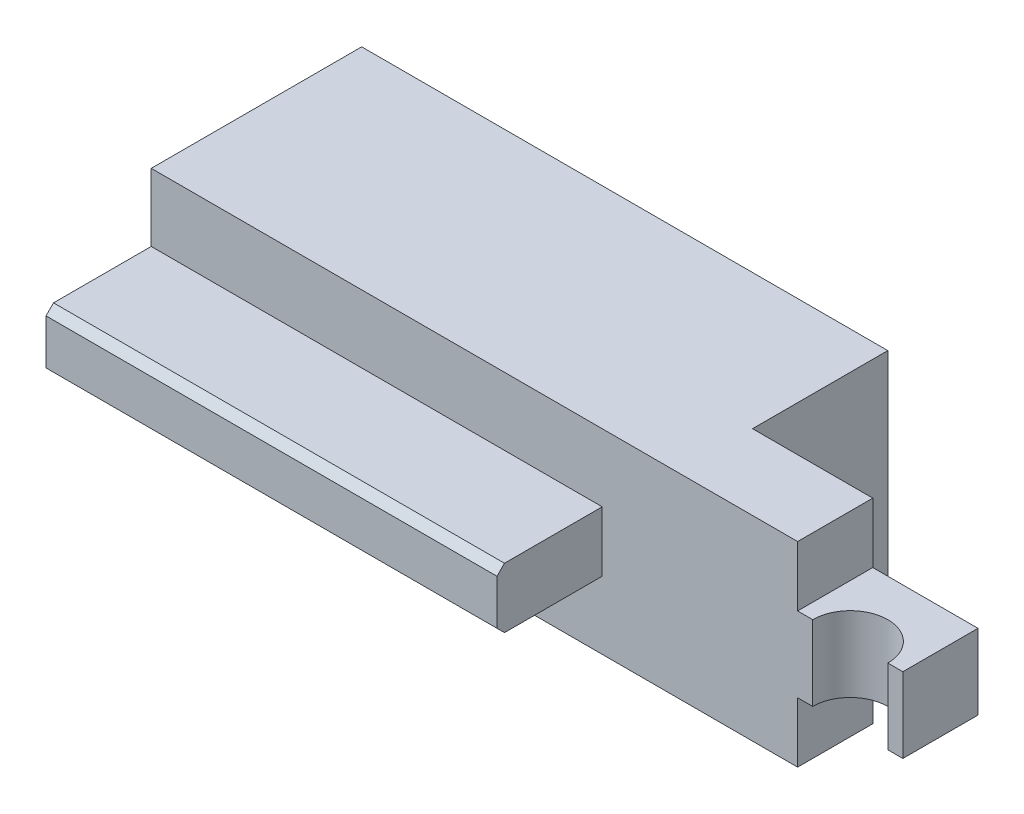
ISO-10303-21;
HEADER;
FILE_DESCRIPTION(('STEP AP214'),'2;1');
FILE_NAME('part.step','',(''),(''),'','','');
FILE_SCHEMA(('AUTOMOTIVE_DESIGN { 1 0 10303 214 1 1 1 1 }'));
ENDSEC;
DATA;
#1=APPLICATION_CONTEXT('core data for automotive mechanical design processes');
#2=APPLICATION_PROTOCOL_DEFINITION('international standard','automotive_design',2000,#1);
#3=PRODUCT_CONTEXT('',#1,'mechanical');
#4=PRODUCT('Part','Part','',(#3));
#5=PRODUCT_RELATED_PRODUCT_CATEGORY('part','',(#4));
#6=PRODUCT_DEFINITION_FORMATION('','',#4);
#7=PRODUCT_DEFINITION_CONTEXT('part definition',#1,'design');
#8=PRODUCT_DEFINITION('design','',#6,#7);
#9=PRODUCT_DEFINITION_SHAPE('','',#8);
#10=(LENGTH_UNIT() NAMED_UNIT(*) SI_UNIT(.MILLI.,.METRE.));
#11=(NAMED_UNIT(*) PLANE_ANGLE_UNIT() SI_UNIT($,.RADIAN.));
#12=(NAMED_UNIT(*) SI_UNIT($,.STERADIAN.) SOLID_ANGLE_UNIT());
#13=UNCERTAINTY_MEASURE_WITH_UNIT(LENGTH_MEASURE(1.E-05),#10,'distance_accuracy_value','');
#14=(GEOMETRIC_REPRESENTATION_CONTEXT(3) GLOBAL_UNCERTAINTY_ASSIGNED_CONTEXT((#13)) GLOBAL_UNIT_ASSIGNED_CONTEXT((#10,
#11,#12)) REPRESENTATION_CONTEXT('',''));
#15=CARTESIAN_POINT('',(0.,0.,0.));
#16=DIRECTION('',(0.,0.,1.));
#17=DIRECTION('',(1.,0.,0.));
#18=AXIS2_PLACEMENT_3D('',#15,#16,#17);
#19=CARTESIAN_POINT('',(43.,11.,25.));
#20=DIRECTION('',(-1.,0.,0.));
#21=DIRECTION('',(0.,0.,1.));
#22=AXIS2_PLACEMENT_3D('',#19,#20,#21);
#23=PLANE('',#22);
#24=DIRECTION('',(0.,0.,1.));
#25=VECTOR('',#24,1.);
#26=CARTESIAN_POINT('',(43.,2.00000000000001,25.));
#27=LINE('',#26,#25);
#28=CARTESIAN_POINT('',(43.,2.,-16.));
#29=VERTEX_POINT('',#28);
#30=CARTESIAN_POINT('',(43.,2.,-11.));
#31=VERTEX_POINT('',#30);
#32=EDGE_CURVE('E355',#29,#31,#27,.T.);
#33=ORIENTED_EDGE('',*,*,#32,.F.);
#34=DIRECTION('',(0.,-1.,0.));
#35=VECTOR('',#34,1.);
#36=CARTESIAN_POINT('',(43.,15.,-16.));
#37=LINE('',#36,#35);
#38=CARTESIAN_POINT('',(43.,6.,-16.));
#39=VERTEX_POINT('',#38);
#40=EDGE_CURVE('E437',#39,#29,#37,.T.);
#41=ORIENTED_EDGE('',*,*,#40,.F.);
#42=DIRECTION('',(0.,0.,-1.));
#43=VECTOR('',#42,1.);
#44=CARTESIAN_POINT('',(43.,6.,25.));
#45=LINE('',#44,#43);
#46=CARTESIAN_POINT('',(43.,6.,-11.));
#47=VERTEX_POINT('',#46);
#48=EDGE_CURVE('E312',#47,#39,#45,.T.);
#49=ORIENTED_EDGE('',*,*,#48,.F.);
#50=DIRECTION('',(0.,-1.,0.));
#51=VECTOR('',#50,1.);
#52=CARTESIAN_POINT('',(43.,11.,-11.));
#53=LINE('',#52,#51);
#54=EDGE_CURVE('E338',#47,#31,#53,.T.);
#55=ORIENTED_EDGE('',*,*,#54,.T.);
#56=EDGE_LOOP('',(#33,#41,#49,#55));
#57=FACE_BOUND('',#56,.T.);
#58=ADVANCED_FACE('F44',(#57),#23,.F.);
#59=CARTESIAN_POINT('',(0.,0.,0.));
#60=DIRECTION('',(1.,0.,0.));
#61=DIRECTION('',(0.,0.,-1.));
#62=AXIS2_PLACEMENT_3D('',#59,#60,#61);
#63=PLANE('',#62);
#64=DIRECTION('',(0.,-1.,0.));
#65=VECTOR('',#64,1.);
#66=CARTESIAN_POINT('',(0.,12.,-22.));
#67=LINE('',#66,#65);
#68=CARTESIAN_POINT('',(0.,12.,-22.));
#69=VERTEX_POINT('',#68);
#70=CARTESIAN_POINT('',(0.,5.,-22.));
#71=VERTEX_POINT('',#70);
#72=EDGE_CURVE('E266',#69,#71,#67,.T.);
#73=ORIENTED_EDGE('',*,*,#72,.F.);
#74=DIRECTION('',(0.,0.,-1.));
#75=VECTOR('',#74,1.);
#76=CARTESIAN_POINT('',(0.,12.,-22.));
#77=LINE('',#76,#75);
#78=CARTESIAN_POINT('',(0.,12.,-14.));
#79=VERTEX_POINT('',#78);
#80=EDGE_CURVE('E250',#79,#69,#77,.T.);
#81=ORIENTED_EDGE('',*,*,#80,.F.);
#82=DIRECTION('',(0.,1.,0.));
#83=VECTOR('',#82,1.);
#84=CARTESIAN_POINT('',(0.,12.,-14.));
#85=LINE('',#84,#83);
#86=CARTESIAN_POINT('',(0.,5.,-14.));
#87=VERTEX_POINT('',#86);
#88=EDGE_CURVE('E255',#87,#79,#85,.T.);
#89=ORIENTED_EDGE('',*,*,#88,.F.);
#90=DIRECTION('',(0.,0.,1.));
#91=VECTOR('',#90,1.);
#92=CARTESIAN_POINT('',(0.,5.,-14.));
#93=LINE('',#92,#91);
#94=EDGE_CURVE('E269',#71,#87,#93,.T.);
#95=ORIENTED_EDGE('',*,*,#94,.F.);
#96=EDGE_LOOP('',(#73,#81,#89,#95));
#97=FACE_BOUND('',#96,.T.);
#98=DIRECTION('',(0.,-0.707106781186547,0.707106781186548));
#99=VECTOR('',#98,1.);
#100=CARTESIAN_POINT('',(0.,11.,-5.));
#101=LINE('',#100,#99);
#102=CARTESIAN_POINT('',(0.,10.5,-4.5));
#103=VERTEX_POINT('',#102);
#104=CARTESIAN_POINT('',(0.,10.,-4.));
#105=VERTEX_POINT('',#104);
#106=EDGE_CURVE('E243',#103,#105,#101,.T.);
#107=ORIENTED_EDGE('',*,*,#106,.F.);
#108=DIRECTION('',(0.,0.,1.));
#109=VECTOR('',#108,1.);
#110=CARTESIAN_POINT('',(0.,10.5,-11.));
#111=LINE('',#110,#109);
#112=CARTESIAN_POINT('',(0.,10.5,-11.));
#113=VERTEX_POINT('',#112);
#114=EDGE_CURVE('E227',#113,#103,#111,.T.);
#115=ORIENTED_EDGE('',*,*,#114,.F.);
#116=DIRECTION('',(0.,1.,0.));
#117=VECTOR('',#116,1.);
#118=CARTESIAN_POINT('',(0.,11.,-11.));
#119=LINE('',#118,#117);
#120=CARTESIAN_POINT('',(0.,15.,-11.));
#121=VERTEX_POINT('',#120);
#122=EDGE_CURVE('E331',#113,#121,#119,.T.);
#123=ORIENTED_EDGE('',*,*,#122,.T.);
#124=DIRECTION('',(0.,0.,1.));
#125=VECTOR('',#124,1.);
#126=CARTESIAN_POINT('',(0.,15.,0.));
#127=LINE('',#126,#125);
#128=CARTESIAN_POINT('',(0.,15.,-25.));
#129=VERTEX_POINT('',#128);
#130=EDGE_CURVE('E286',#129,#121,#127,.T.);
#131=ORIENTED_EDGE('',*,*,#130,.F.);
#132=DIRECTION('',(0.,1.,0.));
#133=VECTOR('',#132,1.);
#134=CARTESIAN_POINT('',(0.,0.,-25.));
#135=LINE('',#134,#133);
#136=CARTESIAN_POINT('',(0.,2.,-25.));
#137=VERTEX_POINT('',#136);
#138=EDGE_CURVE('E330',#137,#129,#135,.T.);
#139=ORIENTED_EDGE('',*,*,#138,.F.);
#140=DIRECTION('',(0.,0.,1.));
#141=VECTOR('',#140,1.);
#142=CARTESIAN_POINT('',(0.,2.00000000000001,0.));
#143=LINE('',#142,#141);
#144=CARTESIAN_POINT('',(0.,2.,-11.));
#145=VERTEX_POINT('',#144);
#146=EDGE_CURVE('E285',#137,#145,#143,.T.);
#147=ORIENTED_EDGE('',*,*,#146,.T.);
#148=DIRECTION('',(0.,-1.,0.));
#149=VECTOR('',#148,1.);
#150=CARTESIAN_POINT('',(0.,6.,-11.));
#151=LINE('',#150,#149);
#152=CARTESIAN_POINT('',(0.,6.5,-11.));
#153=VERTEX_POINT('',#152);
#154=EDGE_CURVE('E327',#153,#145,#151,.T.);
#155=ORIENTED_EDGE('',*,*,#154,.F.);
#156=DIRECTION('',(0.,0.,-1.));
#157=VECTOR('',#156,1.);
#158=CARTESIAN_POINT('',(0.,6.5,-11.));
#159=LINE('',#158,#157);
#160=CARTESIAN_POINT('',(0.,6.5,-4.5));
#161=VERTEX_POINT('',#160);
#162=EDGE_CURVE('E234',#161,#153,#159,.T.);
#163=ORIENTED_EDGE('',*,*,#162,.F.);
#164=DIRECTION('',(0.,0.707106781186548,0.707106781186548));
#165=VECTOR('',#164,1.);
#166=CARTESIAN_POINT('',(0.,6.,-5.));
#167=LINE('',#166,#165);
#168=CARTESIAN_POINT('',(0.,7.,-4.));
#169=VERTEX_POINT('',#168);
#170=EDGE_CURVE('E242',#161,#169,#167,.T.);
#171=ORIENTED_EDGE('',*,*,#170,.T.);
#172=DIRECTION('',(0.,-1.,0.));
#173=VECTOR('',#172,1.);
#174=CARTESIAN_POINT('',(0.,11.,-4.));
#175=LINE('',#174,#173);
#176=EDGE_CURVE('E276',#105,#169,#175,.T.);
#177=ORIENTED_EDGE('',*,*,#176,.F.);
#178=EDGE_LOOP('',(#107,#115,#123,#131,#139,#147,#155,#163,#171,#177));
#179=FACE_BOUND('',#178,.T.);
#180=ADVANCED_FACE('F390',(#97,#179),#63,.F.);
#181=CARTESIAN_POINT('',(30.,-39.,-11.));
#182=DIRECTION('',(-1.,0.,0.));
#183=DIRECTION('',(0.,0.,1.));
#184=AXIS2_PLACEMENT_3D('',#181,#182,#183);
#185=PLANE('',#184);
#186=DIRECTION('',(0.,1.,0.));
#187=VECTOR('',#186,1.);
#188=CARTESIAN_POINT('',(30.,-39.,-11.));
#189=LINE('',#188,#187);
#190=CARTESIAN_POINT('',(30.,6.5,-11.));
#191=VERTEX_POINT('',#190);
#192=CARTESIAN_POINT('',(30.,10.5,-11.));
#193=VERTEX_POINT('',#192);
#194=EDGE_CURVE('E316',#191,#193,#189,.T.);
#195=ORIENTED_EDGE('',*,*,#194,.T.);
#196=DIRECTION('',(0.,0.,1.));
#197=VECTOR('',#196,1.);
#198=CARTESIAN_POINT('',(30.,10.5,-11.));
#199=LINE('',#198,#197);
#200=CARTESIAN_POINT('',(30.,10.5,-4.5));
#201=VERTEX_POINT('',#200);
#202=EDGE_CURVE('E233',#193,#201,#199,.T.);
#203=ORIENTED_EDGE('',*,*,#202,.T.);
#204=DIRECTION('',(0.,-0.707106781186547,0.707106781186548));
#205=VECTOR('',#204,1.);
#206=CARTESIAN_POINT('',(30.,-11.,17.));
#207=LINE('',#206,#205);
#208=CARTESIAN_POINT('',(30.,10.,-4.));
#209=VERTEX_POINT('',#208);
#210=EDGE_CURVE('E248',#201,#209,#207,.T.);
#211=ORIENTED_EDGE('',*,*,#210,.T.);
#212=DIRECTION('',(0.,-1.,0.));
#213=VECTOR('',#212,1.);
#214=CARTESIAN_POINT('',(30.,-39.,-4.));
#215=LINE('',#214,#213);
#216=CARTESIAN_POINT('',(30.,7.,-4.));
#217=VERTEX_POINT('',#216);
#218=EDGE_CURVE('E358',#209,#217,#215,.T.);
#219=ORIENTED_EDGE('',*,*,#218,.T.);
#220=DIRECTION('',(0.,0.707106781186548,0.707106781186548));
#221=VECTOR('',#220,1.);
#222=CARTESIAN_POINT('',(30.,-19.5,-30.5));
#223=LINE('',#222,#221);
#224=CARTESIAN_POINT('',(30.,6.5,-4.49999999999999));
#225=VERTEX_POINT('',#224);
#226=EDGE_CURVE('E245',#225,#217,#223,.T.);
#227=ORIENTED_EDGE('',*,*,#226,.F.);
#228=DIRECTION('',(0.,0.,-1.));
#229=VECTOR('',#228,1.);
#230=CARTESIAN_POINT('',(30.,6.50000000000001,-11.));
#231=LINE('',#230,#229);
#232=EDGE_CURVE('E68',#225,#191,#231,.T.);
#233=ORIENTED_EDGE('',*,*,#232,.T.);
#234=EDGE_LOOP('',(#195,#203,#211,#219,#227,#233));
#235=FACE_BOUND('',#234,.T.);
#236=ADVANCED_FACE('F397',(#235),#185,.F.);
#237=CARTESIAN_POINT('',(50.,11.,-4.));
#238=DIRECTION('',(0.,0.,-1.));
#239=DIRECTION('',(-1.,0.,0.));
#240=AXIS2_PLACEMENT_3D('',#237,#238,#239);
#241=PLANE('',#240);
#242=ORIENTED_EDGE('',*,*,#218,.F.);
#243=DIRECTION('',(-1.,0.,0.));
#244=VECTOR('',#243,1.);
#245=CARTESIAN_POINT('',(50.,10.,-4.));
#246=LINE('',#245,#244);
#247=EDGE_CURVE('E364',#209,#105,#246,.T.);
#248=ORIENTED_EDGE('',*,*,#247,.T.);
#249=ORIENTED_EDGE('',*,*,#176,.T.);
#250=DIRECTION('',(-1.,0.,0.));
#251=VECTOR('',#250,1.);
#252=CARTESIAN_POINT('',(50.,7.,-4.));
#253=LINE('',#252,#251);
#254=EDGE_CURVE('E361',#217,#169,#253,.T.);
#255=ORIENTED_EDGE('',*,*,#254,.F.);
#256=EDGE_LOOP('',(#242,#248,#249,#255));
#257=FACE_BOUND('',#256,.T.);
#258=ADVANCED_FACE('F467',(#257),#241,.F.);
#259=CARTESIAN_POINT('',(50.,0.,-25.));
#260=DIRECTION('',(0.,0.,1.));
#261=DIRECTION('',(1.,0.,0.));
#262=AXIS2_PLACEMENT_3D('',#259,#260,#261);
#263=PLANE('',#262);
#264=CARTESIAN_POINT('',(3.,8.5,-25.));
#265=DIRECTION('',(0.,0.,-1.));
#266=DIRECTION('',(-1.,0.,0.));
#267=AXIS2_PLACEMENT_3D('',#264,#265,#266);
#268=CIRCLE('',#267,1.55);
#269=CARTESIAN_POINT('',(1.45,8.5,-25.));
#270=VERTEX_POINT('',#269);
#271=EDGE_CURVE('E221',#270,#270,#268,.T.);
#272=ORIENTED_EDGE('',*,*,#271,.F.);
#273=EDGE_LOOP('',(#272));
#274=FACE_BOUND('',#273,.T.);
#275=CARTESIAN_POINT('',(11.,8.5,-25.));
#276=DIRECTION('',(0.,0.,-1.));
#277=DIRECTION('',(-1.,0.,0.));
#278=AXIS2_PLACEMENT_3D('',#275,#276,#277);
#279=CIRCLE('',#278,1.55);
#280=CARTESIAN_POINT('',(9.45,8.5,-25.));
#281=VERTEX_POINT('',#280);
#282=EDGE_CURVE('E216',#281,#281,#279,.T.);
#283=ORIENTED_EDGE('',*,*,#282,.F.);
#284=EDGE_LOOP('',(#283));
#285=FACE_BOUND('',#284,.T.);
#286=DIRECTION('',(-1.,0.,0.));
#287=VECTOR('',#286,1.);
#288=CARTESIAN_POINT('',(50.,15.,-25.));
#289=LINE('',#288,#287);
#290=CARTESIAN_POINT('',(35.,15.,-25.));
#291=VERTEX_POINT('',#290);
#292=EDGE_CURVE('E288',#291,#129,#289,.T.);
#293=ORIENTED_EDGE('',*,*,#292,.F.);
#294=DIRECTION('',(0.,1.,0.));
#295=VECTOR('',#294,1.);
#296=CARTESIAN_POINT('',(35.,15.,-25.));
#297=LINE('',#296,#295);
#298=CARTESIAN_POINT('',(35.,2.,-25.));
#299=VERTEX_POINT('',#298);
#300=EDGE_CURVE('E61',#299,#291,#297,.T.);
#301=ORIENTED_EDGE('',*,*,#300,.F.);
#302=DIRECTION('',(-1.,0.,0.));
#303=VECTOR('',#302,1.);
#304=CARTESIAN_POINT('',(50.,2.,-25.));
#305=LINE('',#304,#303);
#306=EDGE_CURVE('E297',#299,#137,#305,.T.);
#307=ORIENTED_EDGE('',*,*,#306,.T.);
#308=ORIENTED_EDGE('',*,*,#138,.T.);
#309=EDGE_LOOP('',(#293,#301,#307,#308));
#310=FACE_BOUND('',#309,.T.);
#311=ADVANCED_FACE('F46',(#274,#285,#310),#263,.F.);
#312=CARTESIAN_POINT('',(50.,11.,-11.));
#313=DIRECTION('',(0.,0.,1.));
#314=DIRECTION('',(1.,0.,0.));
#315=AXIS2_PLACEMENT_3D('',#312,#313,#314);
#316=PLANE('',#315);
#317=DIRECTION('',(-1.,0.,0.));
#318=VECTOR('',#317,1.);
#319=CARTESIAN_POINT('',(50.,10.5,-11.));
#320=LINE('',#319,#318);
#321=EDGE_CURVE('E229',#193,#113,#320,.T.);
#322=ORIENTED_EDGE('',*,*,#321,.F.);
#323=ORIENTED_EDGE('',*,*,#194,.F.);
#324=DIRECTION('',(-1.,0.,0.));
#325=VECTOR('',#324,1.);
#326=CARTESIAN_POINT('',(50.,6.5,-11.));
#327=LINE('',#326,#325);
#328=EDGE_CURVE('E230',#191,#153,#327,.T.);
#329=ORIENTED_EDGE('',*,*,#328,.T.);
#330=ORIENTED_EDGE('',*,*,#154,.T.);
#331=DIRECTION('',(-1.,0.,0.));
#332=VECTOR('',#331,1.);
#333=CARTESIAN_POINT('',(50.,2.,-11.));
#334=LINE('',#333,#332);
#335=EDGE_CURVE('E289',#31,#145,#334,.T.);
#336=ORIENTED_EDGE('',*,*,#335,.F.);
#337=ORIENTED_EDGE('',*,*,#54,.F.);
#338=DIRECTION('',(-1.,0.,0.));
#339=VECTOR('',#338,1.);
#340=CARTESIAN_POINT('',(50.,6.,-11.));
#341=LINE('',#340,#339);
#342=CARTESIAN_POINT('',(44.,6.,-11.));
#343=VERTEX_POINT('',#342);
#344=EDGE_CURVE('E341',#343,#47,#341,.T.);
#345=ORIENTED_EDGE('',*,*,#344,.F.);
#346=DIRECTION('',(0.,1.,0.));
#347=VECTOR('',#346,1.);
#348=CARTESIAN_POINT('',(44.,-39.,-11.));
#349=LINE('',#348,#347);
#350=CARTESIAN_POINT('',(44.,11.,-11.));
#351=VERTEX_POINT('',#350);
#352=EDGE_CURVE('E351',#351,#343,#349,.F.);
#353=ORIENTED_EDGE('',*,*,#352,.F.);
#354=DIRECTION('',(1.,0.,0.));
#355=VECTOR('',#354,1.);
#356=CARTESIAN_POINT('',(50.,11.,-11.));
#357=LINE('',#356,#355);
#358=CARTESIAN_POINT('',(43.,11.,-11.));
#359=VERTEX_POINT('',#358);
#360=EDGE_CURVE('E346',#359,#351,#357,.T.);
#361=ORIENTED_EDGE('',*,*,#360,.F.);
#362=DIRECTION('',(0.,-1.,0.));
#363=VECTOR('',#362,1.);
#364=CARTESIAN_POINT('',(43.,11.,-11.));
#365=LINE('',#364,#363);
#366=CARTESIAN_POINT('',(43.,15.,-11.));
#367=VERTEX_POINT('',#366);
#368=EDGE_CURVE('E349',#367,#359,#365,.T.);
#369=ORIENTED_EDGE('',*,*,#368,.F.);
#370=DIRECTION('',(-1.,0.,0.));
#371=VECTOR('',#370,1.);
#372=CARTESIAN_POINT('',(50.,15.,-11.));
#373=LINE('',#372,#371);
#374=EDGE_CURVE('E290',#367,#121,#373,.T.);
#375=ORIENTED_EDGE('',*,*,#374,.T.);
#376=ORIENTED_EDGE('',*,*,#122,.F.);
#377=EDGE_LOOP('',(#322,#323,#329,#330,#336,#337,#345,#353,#361,#369,#375,#376));
#378=FACE_BOUND('',#377,.T.);
#379=ADVANCED_FACE('F404',(#378),#316,.T.);
#380=DIRECTION('',(0.,0.,-1.));
#381=VECTOR('',#380,1.);
#382=CARTESIAN_POINT('',(43.,11.,25.));
#383=LINE('',#382,#381);
#384=CARTESIAN_POINT('',(43.,11.,-16.));
#385=VERTEX_POINT('',#384);
#386=EDGE_CURVE('E313',#359,#385,#383,.T.);
#387=ORIENTED_EDGE('',*,*,#386,.T.);
#388=CARTESIAN_POINT('',(43.,15.,-16.));
#389=VERTEX_POINT('',#388);
#390=EDGE_CURVE('E209',#389,#385,#37,.T.);
#391=ORIENTED_EDGE('',*,*,#390,.F.);
#392=DIRECTION('',(0.,0.,1.));
#393=VECTOR('',#392,1.);
#394=CARTESIAN_POINT('',(43.,15.,25.));
#395=LINE('',#394,#393);
#396=EDGE_CURVE('E214',#389,#367,#395,.T.);
#397=ORIENTED_EDGE('',*,*,#396,.T.);
#398=ORIENTED_EDGE('',*,*,#368,.T.);
#399=EDGE_LOOP('',(#387,#391,#397,#398));
#400=FACE_BOUND('',#399,.T.);
#401=ADVANCED_FACE('F393',(#400),#23,.F.);
#402=DIRECTION('',(0.,1.,0.));
#403=VECTOR('',#402,1.);
#404=CARTESIAN_POINT('',(50.,11.,-11.));
#405=LINE('',#404,#403);
#406=CARTESIAN_POINT('',(50.,6.,-11.));
#407=VERTEX_POINT('',#406);
#408=CARTESIAN_POINT('',(50.,11.,-11.));
#409=VERTEX_POINT('',#408);
#410=EDGE_CURVE('E328',#407,#409,#405,.T.);
#411=ORIENTED_EDGE('',*,*,#410,.T.);
#412=CARTESIAN_POINT('',(49.,11.,-11.));
#413=VERTEX_POINT('',#412);
#414=EDGE_CURVE('E345',#413,#409,#357,.T.);
#415=ORIENTED_EDGE('',*,*,#414,.F.);
#416=DIRECTION('',(0.,1.,0.));
#417=VECTOR('',#416,1.);
#418=CARTESIAN_POINT('',(49.,-39.,-11.));
#419=LINE('',#418,#417);
#420=CARTESIAN_POINT('',(49.,6.,-11.));
#421=VERTEX_POINT('',#420);
#422=EDGE_CURVE('E353',#421,#413,#419,.T.);
#423=ORIENTED_EDGE('',*,*,#422,.F.);
#424=EDGE_CURVE('E342',#407,#421,#341,.T.);
#425=ORIENTED_EDGE('',*,*,#424,.F.);
#426=EDGE_LOOP('',(#411,#415,#423,#425));
#427=FACE_BOUND('',#426,.T.);
#428=ADVANCED_FACE('F403',(#427),#316,.T.);
#429=CARTESIAN_POINT('',(50.,0.,0.));
#430=DIRECTION('',(1.,0.,0.));
#431=DIRECTION('',(0.,0.,-1.));
#432=AXIS2_PLACEMENT_3D('',#429,#430,#431);
#433=PLANE('',#432);
#434=DIRECTION('',(0.,0.,-1.));
#435=VECTOR('',#434,1.);
#436=CARTESIAN_POINT('',(50.,6.,25.));
#437=LINE('',#436,#435);
#438=CARTESIAN_POINT('',(50.,6.,-16.));
#439=VERTEX_POINT('',#438);
#440=EDGE_CURVE('E320',#407,#439,#437,.T.);
#441=ORIENTED_EDGE('',*,*,#440,.T.);
#442=DIRECTION('',(0.,1.,0.));
#443=VECTOR('',#442,1.);
#444=CARTESIAN_POINT('',(50.,-39.,-16.));
#445=LINE('',#444,#443);
#446=CARTESIAN_POINT('',(50.,11.,-16.));
#447=VERTEX_POINT('',#446);
#448=EDGE_CURVE('E307',#439,#447,#445,.T.);
#449=ORIENTED_EDGE('',*,*,#448,.T.);
#450=DIRECTION('',(0.,0.,-1.));
#451=VECTOR('',#450,1.);
#452=CARTESIAN_POINT('',(50.,11.,25.));
#453=LINE('',#452,#451);
#454=EDGE_CURVE('E317',#409,#447,#453,.T.);
#455=ORIENTED_EDGE('',*,*,#454,.F.);
#456=ORIENTED_EDGE('',*,*,#410,.F.);
#457=EDGE_LOOP('',(#441,#449,#455,#456));
#458=FACE_BOUND('',#457,.T.);
#459=ADVANCED_FACE('F410',(#458),#433,.T.);
#460=CARTESIAN_POINT('',(50.,6.,25.));
#461=DIRECTION('',(0.,1.,0.));
#462=DIRECTION('',(0.,0.,1.));
#463=AXIS2_PLACEMENT_3D('',#460,#461,#462);
#464=PLANE('',#463);
#465=ORIENTED_EDGE('',*,*,#424,.T.);
#466=CARTESIAN_POINT('',(46.5,6.,-11.));
#467=DIRECTION('',(0.,1.,0.));
#468=DIRECTION('',(0.,0.,1.));
#469=AXIS2_PLACEMENT_3D('',#466,#467,#468);
#470=CIRCLE('',#469,2.5);
#471=EDGE_CURVE('E301',#421,#343,#470,.T.);
#472=ORIENTED_EDGE('',*,*,#471,.T.);
#473=ORIENTED_EDGE('',*,*,#344,.T.);
#474=ORIENTED_EDGE('',*,*,#48,.T.);
#475=DIRECTION('',(-1.,0.,0.));
#476=VECTOR('',#475,1.);
#477=CARTESIAN_POINT('',(50.,6.,-16.));
#478=LINE('',#477,#476);
#479=EDGE_CURVE('E310',#439,#39,#478,.T.);
#480=ORIENTED_EDGE('',*,*,#479,.F.);
#481=ORIENTED_EDGE('',*,*,#440,.F.);
#482=EDGE_LOOP('',(#465,#472,#473,#474,#480,#481));
#483=FACE_BOUND('',#482,.T.);
#484=ADVANCED_FACE('F428',(#483),#464,.F.);
#485=CARTESIAN_POINT('',(50.,11.,25.));
#486=DIRECTION('',(0.,-1.,0.));
#487=DIRECTION('',(0.,0.,-1.));
#488=AXIS2_PLACEMENT_3D('',#485,#486,#487);
#489=PLANE('',#488);
#490=ORIENTED_EDGE('',*,*,#360,.T.);
#491=CARTESIAN_POINT('',(46.5,11.,-11.));
#492=DIRECTION('',(0.,1.,0.));
#493=DIRECTION('',(0.,0.,1.));
#494=AXIS2_PLACEMENT_3D('',#491,#492,#493);
#495=CIRCLE('',#494,2.5);
#496=EDGE_CURVE('E293',#413,#351,#495,.T.);
#497=ORIENTED_EDGE('',*,*,#496,.F.);
#498=ORIENTED_EDGE('',*,*,#414,.T.);
#499=ORIENTED_EDGE('',*,*,#454,.T.);
#500=DIRECTION('',(-1.,0.,0.));
#501=VECTOR('',#500,1.);
#502=CARTESIAN_POINT('',(50.,11.,-16.));
#503=LINE('',#502,#501);
#504=EDGE_CURVE('E304',#447,#385,#503,.T.);
#505=ORIENTED_EDGE('',*,*,#504,.T.);
#506=ORIENTED_EDGE('',*,*,#386,.F.);
#507=EDGE_LOOP('',(#490,#497,#498,#499,#505,#506));
#508=FACE_BOUND('',#507,.T.);
#509=ADVANCED_FACE('F418',(#508),#489,.F.);
#510=CARTESIAN_POINT('',(50.,-39.,-16.));
#511=DIRECTION('',(0.,0.,-1.));
#512=DIRECTION('',(-1.,0.,0.));
#513=AXIS2_PLACEMENT_3D('',#510,#511,#512);
#514=PLANE('',#513);
#515=ORIENTED_EDGE('',*,*,#479,.T.);
#516=ORIENTED_EDGE('',*,*,#40,.T.);
#517=DIRECTION('',(1.,0.,0.));
#518=VECTOR('',#517,1.);
#519=CARTESIAN_POINT('',(35.,2.,-16.));
#520=LINE('',#519,#518);
#521=CARTESIAN_POINT('',(35.,2.,-16.));
#522=VERTEX_POINT('',#521);
#523=EDGE_CURVE('E201',#522,#29,#520,.T.);
#524=ORIENTED_EDGE('',*,*,#523,.F.);
#525=DIRECTION('',(0.,-1.,0.));
#526=VECTOR('',#525,1.);
#527=CARTESIAN_POINT('',(35.,15.,-16.));
#528=LINE('',#527,#526);
#529=CARTESIAN_POINT('',(35.,15.,-16.));
#530=VERTEX_POINT('',#529);
#531=EDGE_CURVE('E194',#530,#522,#528,.T.);
#532=ORIENTED_EDGE('',*,*,#531,.F.);
#533=DIRECTION('',(1.,0.,0.));
#534=VECTOR('',#533,1.);
#535=CARTESIAN_POINT('',(35.,15.,-16.));
#536=LINE('',#535,#534);
#537=EDGE_CURVE('E198',#530,#389,#536,.T.);
#538=ORIENTED_EDGE('',*,*,#537,.T.);
#539=ORIENTED_EDGE('',*,*,#390,.T.);
#540=ORIENTED_EDGE('',*,*,#504,.F.);
#541=ORIENTED_EDGE('',*,*,#448,.F.);
#542=EDGE_LOOP('',(#515,#516,#524,#532,#538,#539,#540,#541));
#543=FACE_BOUND('',#542,.T.);
#544=ADVANCED_FACE('F196',(#543),#514,.T.);
#545=CARTESIAN_POINT('',(46.5,-39.,-11.));
#546=DIRECTION('',(0.,1.,0.));
#547=DIRECTION('',(0.,0.,1.));
#548=AXIS2_PLACEMENT_3D('',#545,#546,#547);
#549=CYLINDRICAL_SURFACE('',#548,2.5);
#550=ORIENTED_EDGE('',*,*,#422,.T.);
#551=ORIENTED_EDGE('',*,*,#496,.T.);
#552=ORIENTED_EDGE('',*,*,#352,.T.);
#553=ORIENTED_EDGE('',*,*,#471,.F.);
#554=EDGE_LOOP('',(#550,#551,#552,#553));
#555=FACE_BOUND('',#554,.T.);
#556=ADVANCED_FACE('F425',(#555),#549,.F.);
#557=CARTESIAN_POINT('',(50.,2.00000000000001,0.));
#558=DIRECTION('',(0.,-1.,0.));
#559=DIRECTION('',(0.,0.,-1.));
#560=AXIS2_PLACEMENT_3D('',#557,#558,#559);
#561=PLANE('',#560);
#562=ORIENTED_EDGE('',*,*,#523,.T.);
#563=ORIENTED_EDGE('',*,*,#32,.T.);
#564=ORIENTED_EDGE('',*,*,#335,.T.);
#565=ORIENTED_EDGE('',*,*,#146,.F.);
#566=ORIENTED_EDGE('',*,*,#306,.F.);
#567=DIRECTION('',(0.,0.,-1.));
#568=VECTOR('',#567,1.);
#569=CARTESIAN_POINT('',(35.,2.,-25.));
#570=LINE('',#569,#568);
#571=EDGE_CURVE('E203',#522,#299,#570,.T.);
#572=ORIENTED_EDGE('',*,*,#571,.F.);
#573=EDGE_LOOP('',(#562,#563,#564,#565,#566,#572));
#574=FACE_BOUND('',#573,.T.);
#575=ADVANCED_FACE('F441',(#574),#561,.T.);
#576=CARTESIAN_POINT('',(50.,15.,0.));
#577=DIRECTION('',(0.,-1.,0.));
#578=DIRECTION('',(0.,0.,-1.));
#579=AXIS2_PLACEMENT_3D('',#576,#577,#578);
#580=PLANE('',#579);
#581=ORIENTED_EDGE('',*,*,#396,.F.);
#582=ORIENTED_EDGE('',*,*,#537,.F.);
#583=DIRECTION('',(0.,0.,1.));
#584=VECTOR('',#583,1.);
#585=CARTESIAN_POINT('',(35.,15.,-16.));
#586=LINE('',#585,#584);
#587=EDGE_CURVE('E204',#291,#530,#586,.T.);
#588=ORIENTED_EDGE('',*,*,#587,.F.);
#589=ORIENTED_EDGE('',*,*,#292,.T.);
#590=ORIENTED_EDGE('',*,*,#130,.T.);
#591=ORIENTED_EDGE('',*,*,#374,.F.);
#592=EDGE_LOOP('',(#581,#582,#588,#589,#590,#591));
#593=FACE_BOUND('',#592,.T.);
#594=ADVANCED_FACE('F212',(#593),#580,.F.);
#595=CARTESIAN_POINT('',(30.,12.,-22.));
#596=DIRECTION('',(0.,1.,0.));
#597=DIRECTION('',(0.,0.,1.));
#598=AXIS2_PLACEMENT_3D('',#595,#596,#597);
#599=PLANE('',#598);
#600=ORIENTED_EDGE('',*,*,#80,.T.);
#601=DIRECTION('',(-1.,0.,0.));
#602=VECTOR('',#601,1.);
#603=CARTESIAN_POINT('',(30.,12.,-22.));
#604=LINE('',#603,#602);
#605=CARTESIAN_POINT('',(30.,12.,-22.));
#606=VERTEX_POINT('',#605);
#607=EDGE_CURVE('E264',#606,#69,#604,.T.);
#608=ORIENTED_EDGE('',*,*,#607,.F.);
#609=DIRECTION('',(0.,0.,-1.));
#610=VECTOR('',#609,1.);
#611=CARTESIAN_POINT('',(30.,12.,-22.));
#612=LINE('',#611,#610);
#613=CARTESIAN_POINT('',(30.,12.,-14.));
#614=VERTEX_POINT('',#613);
#615=EDGE_CURVE('E251',#614,#606,#612,.T.);
#616=ORIENTED_EDGE('',*,*,#615,.F.);
#617=DIRECTION('',(-1.,0.,0.));
#618=VECTOR('',#617,1.);
#619=CARTESIAN_POINT('',(30.,12.,-14.));
#620=LINE('',#619,#618);
#621=EDGE_CURVE('E274',#614,#79,#620,.T.);
#622=ORIENTED_EDGE('',*,*,#621,.T.);
#623=EDGE_LOOP('',(#600,#608,#616,#622));
#624=FACE_BOUND('',#623,.T.);
#625=ADVANCED_FACE('F478',(#624),#599,.F.);
#626=CARTESIAN_POINT('',(30.,12.,-14.));
#627=DIRECTION('',(0.,0.,1.));
#628=DIRECTION('',(1.,0.,0.));
#629=AXIS2_PLACEMENT_3D('',#626,#627,#628);
#630=PLANE('',#629);
#631=ORIENTED_EDGE('',*,*,#88,.T.);
#632=ORIENTED_EDGE('',*,*,#621,.F.);
#633=DIRECTION('',(0.,1.,0.));
#634=VECTOR('',#633,1.);
#635=CARTESIAN_POINT('',(30.,12.,-14.));
#636=LINE('',#635,#634);
#637=CARTESIAN_POINT('',(30.,5.,-14.));
#638=VERTEX_POINT('',#637);
#639=EDGE_CURVE('E261',#638,#614,#636,.T.);
#640=ORIENTED_EDGE('',*,*,#639,.F.);
#641=DIRECTION('',(-1.,0.,0.));
#642=VECTOR('',#641,1.);
#643=CARTESIAN_POINT('',(30.,5.,-14.));
#644=LINE('',#643,#642);
#645=EDGE_CURVE('E277',#638,#87,#644,.T.);
#646=ORIENTED_EDGE('',*,*,#645,.T.);
#647=EDGE_LOOP('',(#631,#632,#640,#646));
#648=FACE_BOUND('',#647,.T.);
#649=ADVANCED_FACE('F552',(#648),#630,.F.);
#650=CARTESIAN_POINT('',(30.,5.,-14.));
#651=DIRECTION('',(0.,-1.,0.));
#652=DIRECTION('',(0.,0.,-1.));
#653=AXIS2_PLACEMENT_3D('',#650,#651,#652);
#654=PLANE('',#653);
#655=ORIENTED_EDGE('',*,*,#94,.T.);
#656=ORIENTED_EDGE('',*,*,#645,.F.);
#657=DIRECTION('',(0.,0.,1.));
#658=VECTOR('',#657,1.);
#659=CARTESIAN_POINT('',(30.,5.,-14.));
#660=LINE('',#659,#658);
#661=CARTESIAN_POINT('',(30.,5.,-22.));
#662=VERTEX_POINT('',#661);
#663=EDGE_CURVE('E258',#662,#638,#660,.T.);
#664=ORIENTED_EDGE('',*,*,#663,.F.);
#665=DIRECTION('',(-1.,0.,0.));
#666=VECTOR('',#665,1.);
#667=CARTESIAN_POINT('',(30.,5.,-22.));
#668=LINE('',#667,#666);
#669=EDGE_CURVE('E279',#662,#71,#668,.T.);
#670=ORIENTED_EDGE('',*,*,#669,.T.);
#671=EDGE_LOOP('',(#655,#656,#664,#670));
#672=FACE_BOUND('',#671,.T.);
#673=ADVANCED_FACE('F547',(#672),#654,.F.);
#674=CARTESIAN_POINT('',(30.,12.,-22.));
#675=DIRECTION('',(0.,0.,-1.));
#676=DIRECTION('',(-1.,0.,0.));
#677=AXIS2_PLACEMENT_3D('',#674,#675,#676);
#678=PLANE('',#677);
#679=CARTESIAN_POINT('',(3.,8.5,-22.));
#680=DIRECTION('',(0.,0.,-1.));
#681=DIRECTION('',(-1.,0.,0.));
#682=AXIS2_PLACEMENT_3D('',#679,#680,#681);
#683=CIRCLE('',#682,1.55);
#684=CARTESIAN_POINT('',(1.45,8.5,-22.));
#685=VERTEX_POINT('',#684);
#686=EDGE_CURVE('E48',#685,#685,#683,.T.);
#687=ORIENTED_EDGE('',*,*,#686,.T.);
#688=EDGE_LOOP('',(#687));
#689=FACE_BOUND('',#688,.T.);
#690=CARTESIAN_POINT('',(11.,8.5,-22.));
#691=DIRECTION('',(0.,0.,-1.));
#692=DIRECTION('',(-1.,0.,0.));
#693=AXIS2_PLACEMENT_3D('',#690,#691,#692);
#694=CIRCLE('',#693,1.55);
#695=CARTESIAN_POINT('',(9.45,8.5,-22.));
#696=VERTEX_POINT('',#695);
#697=EDGE_CURVE('E224',#696,#696,#694,.T.);
#698=ORIENTED_EDGE('',*,*,#697,.T.);
#699=EDGE_LOOP('',(#698));
#700=FACE_BOUND('',#699,.T.);
#701=ORIENTED_EDGE('',*,*,#72,.T.);
#702=ORIENTED_EDGE('',*,*,#669,.F.);
#703=DIRECTION('',(0.,-1.,0.));
#704=VECTOR('',#703,1.);
#705=CARTESIAN_POINT('',(30.,12.,-22.));
#706=LINE('',#705,#704);
#707=EDGE_CURVE('E254',#606,#662,#706,.T.);
#708=ORIENTED_EDGE('',*,*,#707,.F.);
#709=ORIENTED_EDGE('',*,*,#607,.T.);
#710=EDGE_LOOP('',(#701,#702,#708,#709));
#711=FACE_BOUND('',#710,.T.);
#712=ADVANCED_FACE('F374',(#689,#700,#711),#678,.F.);
#713=CARTESIAN_POINT('',(30.,0.,0.));
#714=DIRECTION('',(1.,0.,0.));
#715=DIRECTION('',(0.,0.,-1.));
#716=AXIS2_PLACEMENT_3D('',#713,#714,#715);
#717=PLANE('',#716);
#718=ORIENTED_EDGE('',*,*,#615,.T.);
#719=ORIENTED_EDGE('',*,*,#707,.T.);
#720=ORIENTED_EDGE('',*,*,#663,.T.);
#721=ORIENTED_EDGE('',*,*,#639,.T.);
#722=EDGE_LOOP('',(#718,#719,#720,#721));
#723=FACE_BOUND('',#722,.T.);
#724=ADVANCED_FACE('F535',(#723),#717,.F.);
#725=CARTESIAN_POINT('',(50.,6.,-5.));
#726=DIRECTION('',(0.,-0.707106781186548,0.707106781186548));
#727=DIRECTION('',(0.,-0.707106781186548,-0.707106781186548));
#728=AXIS2_PLACEMENT_3D('',#725,#726,#727);
#729=PLANE('',#728);
#730=DIRECTION('',(-1.,0.,0.));
#731=VECTOR('',#730,1.);
#732=CARTESIAN_POINT('',(50.,6.5,-4.5));
#733=LINE('',#732,#731);
#734=EDGE_CURVE('E12',#225,#161,#733,.T.);
#735=ORIENTED_EDGE('',*,*,#734,.F.);
#736=ORIENTED_EDGE('',*,*,#226,.T.);
#737=ORIENTED_EDGE('',*,*,#254,.T.);
#738=ORIENTED_EDGE('',*,*,#170,.F.);
#739=EDGE_LOOP('',(#735,#736,#737,#738));
#740=FACE_BOUND('',#739,.T.);
#741=ADVANCED_FACE('F464',(#740),#729,.T.);
#742=CARTESIAN_POINT('',(50.,11.,-5.));
#743=DIRECTION('',(0.,-0.707106781186548,-0.707106781186547));
#744=DIRECTION('',(0.,0.707106781186547,-0.707106781186548));
#745=AXIS2_PLACEMENT_3D('',#742,#743,#744);
#746=PLANE('',#745);
#747=ORIENTED_EDGE('',*,*,#210,.F.);
#748=DIRECTION('',(-1.,0.,0.));
#749=VECTOR('',#748,1.);
#750=CARTESIAN_POINT('',(50.,10.5,-4.5));
#751=LINE('',#750,#749);
#752=EDGE_CURVE('E53',#201,#103,#751,.T.);
#753=ORIENTED_EDGE('',*,*,#752,.T.);
#754=ORIENTED_EDGE('',*,*,#106,.T.);
#755=ORIENTED_EDGE('',*,*,#247,.F.);
#756=EDGE_LOOP('',(#747,#753,#754,#755));
#757=FACE_BOUND('',#756,.T.);
#758=ADVANCED_FACE('F456',(#757),#746,.F.);
#759=CARTESIAN_POINT('',(50.,10.5,-11.));
#760=DIRECTION('',(0.,-1.,0.));
#761=DIRECTION('',(0.,0.,-1.));
#762=AXIS2_PLACEMENT_3D('',#759,#760,#761);
#763=PLANE('',#762);
#764=ORIENTED_EDGE('',*,*,#321,.T.);
#765=ORIENTED_EDGE('',*,*,#114,.T.);
#766=ORIENTED_EDGE('',*,*,#752,.F.);
#767=ORIENTED_EDGE('',*,*,#202,.F.);
#768=EDGE_LOOP('',(#764,#765,#766,#767));
#769=FACE_BOUND('',#768,.T.);
#770=ADVANCED_FACE('F453',(#769),#763,.F.);
#771=CARTESIAN_POINT('',(50.,6.5,-11.));
#772=DIRECTION('',(0.,1.,0.));
#773=DIRECTION('',(0.,0.,1.));
#774=AXIS2_PLACEMENT_3D('',#771,#772,#773);
#775=PLANE('',#774);
#776=ORIENTED_EDGE('',*,*,#734,.T.);
#777=ORIENTED_EDGE('',*,*,#162,.T.);
#778=ORIENTED_EDGE('',*,*,#328,.F.);
#779=ORIENTED_EDGE('',*,*,#232,.F.);
#780=EDGE_LOOP('',(#776,#777,#778,#779));
#781=FACE_BOUND('',#780,.T.);
#782=ADVANCED_FACE('F386',(#781),#775,.F.);
#783=CARTESIAN_POINT('',(11.,8.5,-20.));
#784=DIRECTION('',(0.,0.,-1.));
#785=DIRECTION('',(-1.,0.,0.));
#786=AXIS2_PLACEMENT_3D('',#783,#784,#785);
#787=CYLINDRICAL_SURFACE('',#786,1.55);
#788=ORIENTED_EDGE('',*,*,#282,.T.);
#789=EDGE_LOOP('',(#788));
#790=FACE_BOUND('',#789,.T.);
#791=ORIENTED_EDGE('',*,*,#697,.F.);
#792=EDGE_LOOP('',(#791));
#793=FACE_BOUND('',#792,.T.);
#794=ADVANCED_FACE('F378',(#790,#793),#787,.F.);
#795=CARTESIAN_POINT('',(3.,8.5,-20.));
#796=DIRECTION('',(0.,0.,-1.));
#797=DIRECTION('',(-1.,0.,0.));
#798=AXIS2_PLACEMENT_3D('',#795,#796,#797);
#799=CYLINDRICAL_SURFACE('',#798,1.55);
#800=ORIENTED_EDGE('',*,*,#271,.T.);
#801=EDGE_LOOP('',(#800));
#802=FACE_BOUND('',#801,.T.);
#803=ORIENTED_EDGE('',*,*,#686,.F.);
#804=EDGE_LOOP('',(#803));
#805=FACE_BOUND('',#804,.T.);
#806=ADVANCED_FACE('F376',(#802,#805),#799,.F.);
#807=CARTESIAN_POINT('',(35.,0.,0.));
#808=DIRECTION('',(-1.,0.,0.));
#809=DIRECTION('',(0.,0.,1.));
#810=AXIS2_PLACEMENT_3D('',#807,#808,#809);
#811=PLANE('',#810);
#812=ORIENTED_EDGE('',*,*,#587,.T.);
#813=ORIENTED_EDGE('',*,*,#531,.T.);
#814=ORIENTED_EDGE('',*,*,#571,.T.);
#815=ORIENTED_EDGE('',*,*,#300,.T.);
#816=EDGE_LOOP('',(#812,#813,#814,#815));
#817=FACE_BOUND('',#816,.T.);
#818=ADVANCED_FACE('F206',(#817),#811,.F.);
#819=CLOSED_SHELL('',(#58,#180,#236,#258,#311,#379,#401,#428,#459,#484,#509,#544,#556,#575,#594,
#625,#649,#673,#712,#724,#741,#758,#770,#782,#794,#806,#818));
#820=MANIFOLD_SOLID_BREP('B2',#819);
#821=ADVANCED_BREP_SHAPE_REPRESENTATION('',(#18,#820),#14);
#822=SHAPE_DEFINITION_REPRESENTATION(#9,#821);
ENDSEC;
END-ISO-10303-21;
